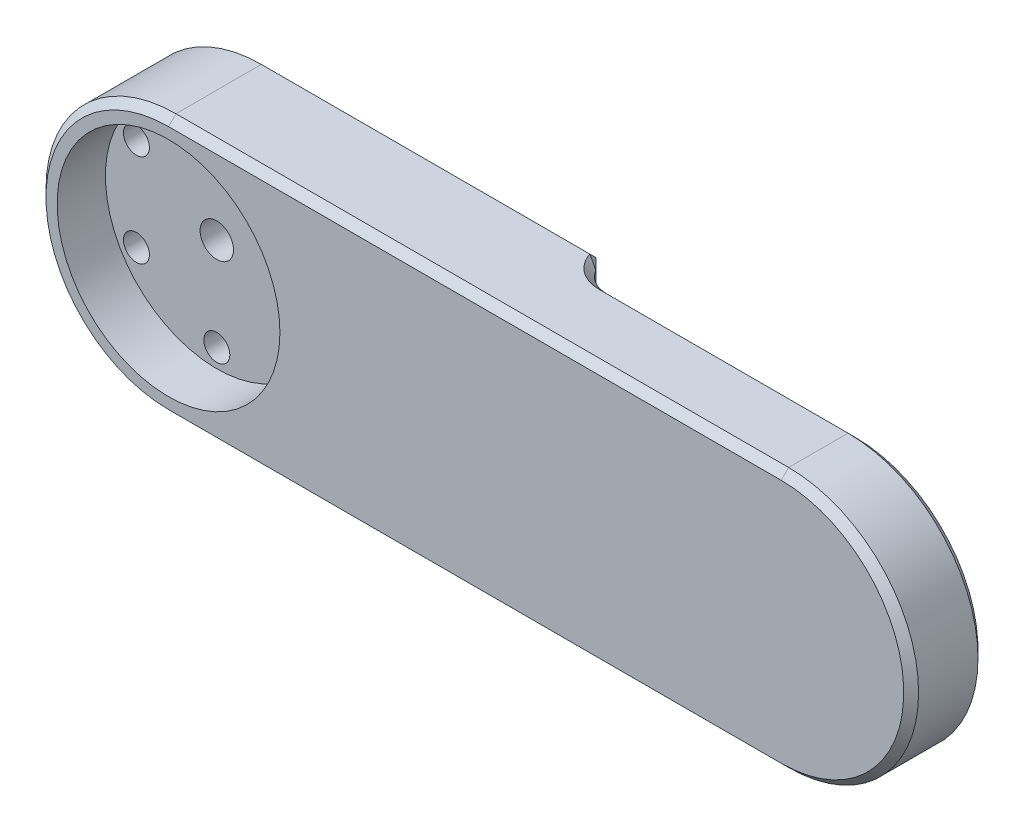
ISO-10303-21;
HEADER;
FILE_DESCRIPTION(('STEP AP214'),'2;1');
FILE_NAME('part.step','',(''),(''),'','','');
FILE_SCHEMA(('AUTOMOTIVE_DESIGN { 1 0 10303 214 1 1 1 1 }'));
ENDSEC;
DATA;
#1=APPLICATION_CONTEXT('core data for automotive mechanical design processes');
#2=APPLICATION_PROTOCOL_DEFINITION('international standard','automotive_design',2000,#1);
#3=PRODUCT_CONTEXT('',#1,'mechanical');
#4=PRODUCT('Part','Part','',(#3));
#5=PRODUCT_RELATED_PRODUCT_CATEGORY('part','',(#4));
#6=PRODUCT_DEFINITION_FORMATION('','',#4);
#7=PRODUCT_DEFINITION_CONTEXT('part definition',#1,'design');
#8=PRODUCT_DEFINITION('design','',#6,#7);
#9=PRODUCT_DEFINITION_SHAPE('','',#8);
#10=(LENGTH_UNIT() NAMED_UNIT(*) SI_UNIT(.MILLI.,.METRE.));
#11=(NAMED_UNIT(*) PLANE_ANGLE_UNIT() SI_UNIT($,.RADIAN.));
#12=(NAMED_UNIT(*) SI_UNIT($,.STERADIAN.) SOLID_ANGLE_UNIT());
#13=UNCERTAINTY_MEASURE_WITH_UNIT(LENGTH_MEASURE(1.E-05),#10,'distance_accuracy_value','');
#14=(GEOMETRIC_REPRESENTATION_CONTEXT(3) GLOBAL_UNCERTAINTY_ASSIGNED_CONTEXT((#13)) GLOBAL_UNIT_ASSIGNED_CONTEXT((#10,
#11,#12)) REPRESENTATION_CONTEXT('',''));
#15=CARTESIAN_POINT('',(0.,0.,0.));
#16=DIRECTION('',(0.,0.,1.));
#17=DIRECTION('',(1.,0.,0.));
#18=AXIS2_PLACEMENT_3D('',#15,#16,#17);
#19=CARTESIAN_POINT('',(-82.5,0.,-13.5));
#20=DIRECTION('',(0.,0.,1.));
#21=DIRECTION('',(1.,0.,0.));
#22=AXIS2_PLACEMENT_3D('',#19,#20,#21);
#23=PLANE('',#22);
#24=DIRECTION('',(1.,0.,0.));
#25=VECTOR('',#24,1.);
#26=CARTESIAN_POINT('',(-82.5,33.,-13.5));
#27=LINE('',#26,#25);
#28=CARTESIAN_POINT('',(-82.5,33.,-13.5));
#29=VERTEX_POINT('',#28);
#30=CARTESIAN_POINT('',(5.56274606680728,33.,-13.5));
#31=VERTEX_POINT('',#30);
#32=EDGE_CURVE('E163',#29,#31,#27,.T.);
#33=ORIENTED_EDGE('',*,*,#32,.T.);
#34=DIRECTION('',(0.,-1.,0.));
#35=VECTOR('',#34,1.);
#36=CARTESIAN_POINT('',(5.56274606680619,-35.,-13.5));
#37=LINE('',#36,#35);
#38=CARTESIAN_POINT('',(5.56274606680622,-33.,-13.5));
#39=VERTEX_POINT('',#38);
#40=EDGE_CURVE('E174',#31,#39,#37,.T.);
#41=ORIENTED_EDGE('',*,*,#40,.T.);
#42=DIRECTION('',(-1.,0.,0.));
#43=VECTOR('',#42,1.);
#44=CARTESIAN_POINT('',(-82.5,-33.,-13.5));
#45=LINE('',#44,#43);
#46=CARTESIAN_POINT('',(-82.5,-33.,-13.5));
#47=VERTEX_POINT('',#46);
#48=EDGE_CURVE('E172',#39,#47,#45,.T.);
#49=ORIENTED_EDGE('',*,*,#48,.T.);
#50=CARTESIAN_POINT('',(-82.5,0.,-13.5));
#51=DIRECTION('',(0.,0.,1.));
#52=DIRECTION('',(1.,0.,0.));
#53=AXIS2_PLACEMENT_3D('',#50,#51,#52);
#54=CIRCLE('',#53,33.);
#55=EDGE_CURVE('E166',#47,#29,#54,.F.);
#56=ORIENTED_EDGE('',*,*,#55,.T.);
#57=EDGE_LOOP('',(#33,#41,#49,#56));
#58=FACE_BOUND('',#57,.T.);
#59=CARTESIAN_POINT('',(-104.15063509461,12.4999999999997,-13.5));
#60=DIRECTION('',(0.,0.,1.));
#61=DIRECTION('',(1.,0.,0.));
#62=AXIS2_PLACEMENT_3D('',#59,#60,#61);
#63=CIRCLE('',#62,3.5);
#64=CARTESIAN_POINT('',(-100.65063509461,12.4999999999997,-13.5));
#65=VERTEX_POINT('',#64);
#66=EDGE_CURVE('E400',#65,#65,#63,.T.);
#67=ORIENTED_EDGE('',*,*,#66,.T.);
#68=EDGE_LOOP('',(#67));
#69=FACE_BOUND('',#68,.T.);
#70=CARTESIAN_POINT('',(-104.15063509461,-12.5000000000004,-13.5));
#71=DIRECTION('',(0.,0.,1.));
#72=DIRECTION('',(1.,0.,0.));
#73=AXIS2_PLACEMENT_3D('',#70,#71,#72);
#74=CIRCLE('',#73,3.50000000000001);
#75=CARTESIAN_POINT('',(-100.65063509461,-12.5000000000004,-13.5));
#76=VERTEX_POINT('',#75);
#77=EDGE_CURVE('E403',#76,#76,#74,.T.);
#78=ORIENTED_EDGE('',*,*,#77,.T.);
#79=EDGE_LOOP('',(#78));
#80=FACE_BOUND('',#79,.T.);
#81=CARTESIAN_POINT('',(-82.5,-25.,-13.5));
#82=DIRECTION('',(0.,0.,1.));
#83=DIRECTION('',(1.,0.,0.));
#84=AXIS2_PLACEMENT_3D('',#81,#82,#83);
#85=CIRCLE('',#84,3.49999999999882);
#86=CARTESIAN_POINT('',(-79.0000000000012,-25.,-13.5));
#87=VERTEX_POINT('',#86);
#88=EDGE_CURVE('E407',#87,#87,#85,.T.);
#89=ORIENTED_EDGE('',*,*,#88,.T.);
#90=EDGE_LOOP('',(#89));
#91=FACE_BOUND('',#90,.T.);
#92=CARTESIAN_POINT('',(-60.849364905388,-12.4999999999995,-13.5));
#93=DIRECTION('',(0.,0.,1.));
#94=DIRECTION('',(1.,0.,0.));
#95=AXIS2_PLACEMENT_3D('',#92,#93,#94);
#96=CIRCLE('',#95,3.50000000000002);
#97=CARTESIAN_POINT('',(-57.349364905388,-12.4999999999995,-13.5));
#98=VERTEX_POINT('',#97);
#99=EDGE_CURVE('E410',#98,#98,#96,.T.);
#100=ORIENTED_EDGE('',*,*,#99,.T.);
#101=EDGE_LOOP('',(#100));
#102=FACE_BOUND('',#101,.T.);
#103=CARTESIAN_POINT('',(-60.8493649053887,12.5000000000006,-13.5));
#104=DIRECTION('',(0.,0.,1.));
#105=DIRECTION('',(1.,0.,0.));
#106=AXIS2_PLACEMENT_3D('',#103,#104,#105);
#107=CIRCLE('',#106,3.50000000000002);
#108=CARTESIAN_POINT('',(-57.3493649053886,12.5000000000006,-13.5));
#109=VERTEX_POINT('',#108);
#110=EDGE_CURVE('E413',#109,#109,#107,.T.);
#111=ORIENTED_EDGE('',*,*,#110,.T.);
#112=EDGE_LOOP('',(#111));
#113=FACE_BOUND('',#112,.T.);
#114=CARTESIAN_POINT('',(-82.5,25.,-13.5));
#115=DIRECTION('',(0.,0.,1.));
#116=DIRECTION('',(1.,0.,0.));
#117=AXIS2_PLACEMENT_3D('',#114,#115,#116);
#118=CIRCLE('',#117,3.50000000000001);
#119=CARTESIAN_POINT('',(-79.,25.,-13.5));
#120=VERTEX_POINT('',#119);
#121=EDGE_CURVE('E399',#120,#120,#118,.T.);
#122=ORIENTED_EDGE('',*,*,#121,.T.);
#123=EDGE_LOOP('',(#122));
#124=FACE_BOUND('',#123,.T.);
#125=CARTESIAN_POINT('',(-82.5,0.,-13.5));
#126=DIRECTION('',(0.,0.,1.));
#127=DIRECTION('',(1.,0.,0.));
#128=AXIS2_PLACEMENT_3D('',#125,#126,#127);
#129=CIRCLE('',#128,4.5);
#130=CARTESIAN_POINT('',(-78.,0.,-13.5));
#131=VERTEX_POINT('',#130);
#132=EDGE_CURVE('E147',#131,#131,#129,.T.);
#133=ORIENTED_EDGE('',*,*,#132,.T.);
#134=EDGE_LOOP('',(#133));
#135=FACE_BOUND('',#134,.T.);
#136=ADVANCED_FACE('F39',(#58,#69,#80,#91,#102,#113,#124,#135),#23,.F.);
#137=CARTESIAN_POINT('',(82.5,0.,13.5));
#138=DIRECTION('',(0.,0.,-1.));
#139=DIRECTION('',(-1.,0.,0.));
#140=AXIS2_PLACEMENT_3D('',#137,#138,#139);
#141=CYLINDRICAL_SURFACE('',#140,35.);
#142=DIRECTION('',(0.,0.,-1.));
#143=VECTOR('',#142,1.);
#144=CARTESIAN_POINT('',(82.5,35.,13.5));
#145=LINE('',#144,#143);
#146=CARTESIAN_POINT('',(82.5,35.,11.5));
#147=VERTEX_POINT('',#146);
#148=CARTESIAN_POINT('',(82.5,35.,-4.5));
#149=VERTEX_POINT('',#148);
#150=EDGE_CURVE('E392',#147,#149,#145,.T.);
#151=ORIENTED_EDGE('',*,*,#150,.F.);
#152=CARTESIAN_POINT('',(82.5,0.,11.5));
#153=DIRECTION('',(0.,0.,1.));
#154=DIRECTION('',(1.,0.,0.));
#155=AXIS2_PLACEMENT_3D('',#152,#153,#154);
#156=CIRCLE('',#155,35.);
#157=CARTESIAN_POINT('',(82.5,-35.,11.5));
#158=VERTEX_POINT('',#157);
#159=EDGE_CURVE('E196',#147,#158,#156,.F.);
#160=ORIENTED_EDGE('',*,*,#159,.T.);
#161=DIRECTION('',(0.,0.,-1.));
#162=VECTOR('',#161,1.);
#163=CARTESIAN_POINT('',(82.5,-35.,13.5));
#164=LINE('',#163,#162);
#165=CARTESIAN_POINT('',(82.5,-35.,-4.5));
#166=VERTEX_POINT('',#165);
#167=EDGE_CURVE('E382',#158,#166,#164,.T.);
#168=ORIENTED_EDGE('',*,*,#167,.T.);
#169=CARTESIAN_POINT('',(82.5,0.,-4.5));
#170=DIRECTION('',(0.,0.,-1.));
#171=DIRECTION('',(-1.,0.,0.));
#172=AXIS2_PLACEMENT_3D('',#169,#170,#171);
#173=CIRCLE('',#172,35.);
#174=EDGE_CURVE('E194',#166,#149,#173,.F.);
#175=ORIENTED_EDGE('',*,*,#174,.T.);
#176=EDGE_LOOP('',(#151,#160,#168,#175));
#177=FACE_BOUND('',#176,.T.);
#178=ADVANCED_FACE('F326',(#177),#141,.T.);
#179=CARTESIAN_POINT('',(-82.5,0.,13.5));
#180=DIRECTION('',(0.,0.,-1.));
#181=DIRECTION('',(-1.,0.,0.));
#182=AXIS2_PLACEMENT_3D('',#179,#180,#181);
#183=CYLINDRICAL_SURFACE('',#182,35.);
#184=DIRECTION('',(0.,0.,-1.));
#185=VECTOR('',#184,1.);
#186=CARTESIAN_POINT('',(-82.5,-35.,13.5));
#187=LINE('',#186,#185);
#188=CARTESIAN_POINT('',(-82.5,-35.,11.5));
#189=VERTEX_POINT('',#188);
#190=CARTESIAN_POINT('',(-82.5,-35.,-11.5));
#191=VERTEX_POINT('',#190);
#192=EDGE_CURVE('E380',#189,#191,#187,.T.);
#193=ORIENTED_EDGE('',*,*,#192,.F.);
#194=CARTESIAN_POINT('',(-82.5,0.,11.5));
#195=DIRECTION('',(0.,0.,1.));
#196=DIRECTION('',(1.,0.,0.));
#197=AXIS2_PLACEMENT_3D('',#194,#195,#196);
#198=CIRCLE('',#197,35.);
#199=CARTESIAN_POINT('',(-82.5,35.,11.5));
#200=VERTEX_POINT('',#199);
#201=EDGE_CURVE('E200',#189,#200,#198,.F.);
#202=ORIENTED_EDGE('',*,*,#201,.T.);
#203=DIRECTION('',(0.,0.,-1.));
#204=VECTOR('',#203,1.);
#205=CARTESIAN_POINT('',(-82.5,35.,13.5));
#206=LINE('',#205,#204);
#207=CARTESIAN_POINT('',(-82.5,35.,-11.5));
#208=VERTEX_POINT('',#207);
#209=EDGE_CURVE('E146',#200,#208,#206,.T.);
#210=ORIENTED_EDGE('',*,*,#209,.T.);
#211=CARTESIAN_POINT('',(-82.5,0.,-11.5));
#212=DIRECTION('',(0.,0.,1.));
#213=DIRECTION('',(1.,0.,0.));
#214=AXIS2_PLACEMENT_3D('',#211,#212,#213);
#215=CIRCLE('',#214,35.);
#216=EDGE_CURVE('E198',#208,#191,#215,.T.);
#217=ORIENTED_EDGE('',*,*,#216,.T.);
#218=EDGE_LOOP('',(#193,#202,#210,#217));
#219=FACE_BOUND('',#218,.T.);
#220=ADVANCED_FACE('F332',(#219),#183,.T.);
#221=CARTESIAN_POINT('',(-82.5,-35.,13.5));
#222=DIRECTION('',(0.,1.,0.));
#223=DIRECTION('',(-1.,0.,0.));
#224=AXIS2_PLACEMENT_3D('',#221,#222,#223);
#225=PLANE('',#224);
#226=ORIENTED_EDGE('',*,*,#167,.F.);
#227=DIRECTION('',(-1.,0.,0.));
#228=VECTOR('',#227,1.);
#229=CARTESIAN_POINT('',(-82.5,-35.,11.5));
#230=LINE('',#229,#228);
#231=EDGE_CURVE('E191',#158,#189,#230,.T.);
#232=ORIENTED_EDGE('',*,*,#231,.T.);
#233=ORIENTED_EDGE('',*,*,#192,.T.);
#234=DIRECTION('',(1.,0.,0.));
#235=VECTOR('',#234,1.);
#236=CARTESIAN_POINT('',(-82.5,-35.,-11.5));
#237=LINE('',#236,#235);
#238=CARTESIAN_POINT('',(5.96060798583056,-35.,-11.5));
#239=VERTEX_POINT('',#238);
#240=EDGE_CURVE('E186',#191,#239,#237,.T.);
#241=ORIENTED_EDGE('',*,*,#240,.T.);
#242=CARTESIAN_POINT('',(15.5,-35.,-14.5));
#243=DIRECTION('',(0.,1.,0.));
#244=DIRECTION('',(-1.,0.,0.));
#245=AXIS2_PLACEMENT_3D('',#242,#243,#244);
#246=CIRCLE('',#245,10.);
#247=CARTESIAN_POINT('',(15.5,-35.,-4.5));
#248=VERTEX_POINT('',#247);
#249=EDGE_CURVE('E188',#239,#248,#246,.T.);
#250=ORIENTED_EDGE('',*,*,#249,.T.);
#251=DIRECTION('',(1.,0.,0.));
#252=VECTOR('',#251,1.);
#253=CARTESIAN_POINT('',(82.5,-35.,-4.5));
#254=LINE('',#253,#252);
#255=EDGE_CURVE('E152',#248,#166,#254,.T.);
#256=ORIENTED_EDGE('',*,*,#255,.T.);
#257=EDGE_LOOP('',(#226,#232,#233,#241,#250,#256));
#258=FACE_BOUND('',#257,.T.);
#259=ADVANCED_FACE('F342',(#258),#225,.F.);
#260=CARTESIAN_POINT('',(-82.5,35.,13.5));
#261=DIRECTION('',(0.,-1.,0.));
#262=DIRECTION('',(1.,0.,0.));
#263=AXIS2_PLACEMENT_3D('',#260,#261,#262);
#264=PLANE('',#263);
#265=ORIENTED_EDGE('',*,*,#209,.F.);
#266=DIRECTION('',(1.,0.,0.));
#267=VECTOR('',#266,1.);
#268=CARTESIAN_POINT('',(82.5,35.,11.5));
#269=LINE('',#268,#267);
#270=EDGE_CURVE('E208',#200,#147,#269,.T.);
#271=ORIENTED_EDGE('',*,*,#270,.T.);
#272=ORIENTED_EDGE('',*,*,#150,.T.);
#273=DIRECTION('',(-1.,0.,0.));
#274=VECTOR('',#273,1.);
#275=CARTESIAN_POINT('',(15.5,35.,-4.50000000000001));
#276=LINE('',#275,#274);
#277=CARTESIAN_POINT('',(15.5,35.,-4.49999999999996));
#278=VERTEX_POINT('',#277);
#279=EDGE_CURVE('E206',#149,#278,#276,.T.);
#280=ORIENTED_EDGE('',*,*,#279,.T.);
#281=CARTESIAN_POINT('',(15.5,35.,-14.5));
#282=DIRECTION('',(0.,-1.,0.));
#283=DIRECTION('',(1.,0.,0.));
#284=AXIS2_PLACEMENT_3D('',#281,#282,#283);
#285=CIRCLE('',#284,10.0000000000001);
#286=CARTESIAN_POINT('',(5.96060798583051,35.,-11.5));
#287=VERTEX_POINT('',#286);
#288=EDGE_CURVE('E204',#278,#287,#285,.T.);
#289=ORIENTED_EDGE('',*,*,#288,.T.);
#290=DIRECTION('',(-1.,0.,0.));
#291=VECTOR('',#290,1.);
#292=CARTESIAN_POINT('',(-82.5,35.,-11.5));
#293=LINE('',#292,#291);
#294=EDGE_CURVE('E202',#287,#208,#293,.T.);
#295=ORIENTED_EDGE('',*,*,#294,.T.);
#296=EDGE_LOOP('',(#265,#271,#272,#280,#289,#295));
#297=FACE_BOUND('',#296,.T.);
#298=ADVANCED_FACE('F340',(#297),#264,.F.);
#299=CARTESIAN_POINT('',(-82.5,0.,13.5));
#300=DIRECTION('',(0.,0.,1.));
#301=DIRECTION('',(1.,0.,0.));
#302=AXIS2_PLACEMENT_3D('',#299,#300,#301);
#303=PLANE('',#302);
#304=CARTESIAN_POINT('',(-82.5,0.,13.5));
#305=DIRECTION('',(0.,0.,1.));
#306=DIRECTION('',(1.,0.,0.));
#307=AXIS2_PLACEMENT_3D('',#304,#305,#306);
#308=CIRCLE('',#307,33.);
#309=CARTESIAN_POINT('',(-82.5,33.,13.5));
#310=VERTEX_POINT('',#309);
#311=CARTESIAN_POINT('',(-82.5,-33.,13.5));
#312=VERTEX_POINT('',#311);
#313=EDGE_CURVE('E179',#310,#312,#308,.T.);
#314=ORIENTED_EDGE('',*,*,#313,.T.);
#315=DIRECTION('',(1.,0.,0.));
#316=VECTOR('',#315,1.);
#317=CARTESIAN_POINT('',(82.5,-33.,13.5));
#318=LINE('',#317,#316);
#319=CARTESIAN_POINT('',(82.5,-33.,13.5));
#320=VERTEX_POINT('',#319);
#321=EDGE_CURVE('E183',#312,#320,#318,.T.);
#322=ORIENTED_EDGE('',*,*,#321,.T.);
#323=CARTESIAN_POINT('',(82.5,0.,13.5));
#324=DIRECTION('',(0.,0.,1.));
#325=DIRECTION('',(1.,0.,0.));
#326=AXIS2_PLACEMENT_3D('',#323,#324,#325);
#327=CIRCLE('',#326,33.);
#328=CARTESIAN_POINT('',(82.5,33.,13.5));
#329=VERTEX_POINT('',#328);
#330=EDGE_CURVE('E181',#320,#329,#327,.T.);
#331=ORIENTED_EDGE('',*,*,#330,.T.);
#332=DIRECTION('',(-1.,0.,0.));
#333=VECTOR('',#332,1.);
#334=CARTESIAN_POINT('',(-82.5,33.,13.5));
#335=LINE('',#334,#333);
#336=EDGE_CURVE('E177',#329,#310,#335,.T.);
#337=ORIENTED_EDGE('',*,*,#336,.T.);
#338=EDGE_LOOP('',(#314,#322,#331,#337));
#339=FACE_BOUND('',#338,.T.);
#340=CARTESIAN_POINT('',(-82.5,0.,13.5));
#341=DIRECTION('',(0.,0.,-1.));
#342=DIRECTION('',(-1.,0.,0.));
#343=AXIS2_PLACEMENT_3D('',#340,#341,#342);
#344=CIRCLE('',#343,30.);
#345=CARTESIAN_POINT('',(-52.5,0.,13.5));
#346=VERTEX_POINT('',#345);
#347=EDGE_CURVE('E434',#346,#346,#344,.T.);
#348=ORIENTED_EDGE('',*,*,#347,.T.);
#349=EDGE_LOOP('',(#348));
#350=FACE_BOUND('',#349,.T.);
#351=ADVANCED_FACE('F338',(#339,#350),#303,.T.);
#352=CARTESIAN_POINT('',(117.5,-343.357544094514,-6.5));
#353=DIRECTION('',(0.,0.,-1.));
#354=DIRECTION('',(-1.,0.,0.));
#355=AXIS2_PLACEMENT_3D('',#352,#353,#354);
#356=PLANE('',#355);
#357=CARTESIAN_POINT('',(82.5,0.,-6.50000000000001));
#358=DIRECTION('',(0.,0.,-1.));
#359=DIRECTION('',(-1.,0.,0.));
#360=AXIS2_PLACEMENT_3D('',#357,#358,#359);
#361=CIRCLE('',#360,15.);
#362=CARTESIAN_POINT('',(67.5,0.,-6.50000000000001));
#363=VERTEX_POINT('',#362);
#364=EDGE_CURVE('E444',#363,#363,#361,.T.);
#365=ORIENTED_EDGE('',*,*,#364,.F.);
#366=EDGE_LOOP('',(#365));
#367=FACE_BOUND('',#366,.T.);
#368=CARTESIAN_POINT('',(82.5,0.,-6.50000000000001));
#369=DIRECTION('',(0.,0.,-1.));
#370=DIRECTION('',(-1.,0.,0.));
#371=AXIS2_PLACEMENT_3D('',#368,#369,#370);
#372=CIRCLE('',#371,33.);
#373=CARTESIAN_POINT('',(82.5,33.,-6.50000000000001));
#374=VERTEX_POINT('',#373);
#375=CARTESIAN_POINT('',(82.5,-33.,-6.50000000000001));
#376=VERTEX_POINT('',#375);
#377=EDGE_CURVE('E49',#374,#376,#372,.T.);
#378=ORIENTED_EDGE('',*,*,#377,.T.);
#379=DIRECTION('',(-1.,0.,0.));
#380=VECTOR('',#379,1.);
#381=CARTESIAN_POINT('',(15.5,-32.9999999999999,-6.50000000000001));
#382=LINE('',#381,#380);
#383=CARTESIAN_POINT('',(15.5,-33.,-6.50000000000001));
#384=VERTEX_POINT('',#383);
#385=EDGE_CURVE('E12',#376,#384,#382,.T.);
#386=ORIENTED_EDGE('',*,*,#385,.T.);
#387=DIRECTION('',(0.,1.,0.));
#388=VECTOR('',#387,1.);
#389=CARTESIAN_POINT('',(15.5000000000001,-343.357544094514,-6.50000000000001));
#390=LINE('',#389,#388);
#391=CARTESIAN_POINT('',(15.5,32.9999999999999,-6.50000000000001));
#392=VERTEX_POINT('',#391);
#393=EDGE_CURVE('E134',#384,#392,#390,.T.);
#394=ORIENTED_EDGE('',*,*,#393,.T.);
#395=DIRECTION('',(1.,0.,0.));
#396=VECTOR('',#395,1.);
#397=CARTESIAN_POINT('',(82.5,33.,-6.50000000000001));
#398=LINE('',#397,#396);
#399=EDGE_CURVE('E60',#392,#374,#398,.T.);
#400=ORIENTED_EDGE('',*,*,#399,.T.);
#401=EDGE_LOOP('',(#378,#386,#394,#400));
#402=FACE_BOUND('',#401,.T.);
#403=ADVANCED_FACE('F133',(#367,#402),#356,.T.);
#404=CARTESIAN_POINT('',(15.5000000000001,-343.357544094514,-14.5));
#405=DIRECTION('',(0.,1.,0.));
#406=DIRECTION('',(-1.,0.,0.));
#407=AXIS2_PLACEMENT_3D('',#404,#405,#406);
#408=CYLINDRICAL_SURFACE('',#407,8.);
#409=ORIENTED_EDGE('',*,*,#393,.F.);
#410=CARTESIAN_POINT('',(15.5,-33.,-14.5));
#411=DIRECTION('',(0.,1.,0.));
#412=DIRECTION('',(0.,0.,1.));
#413=AXIS2_PLACEMENT_3D('',#410,#411,#412);
#414=CIRCLE('',#413,8.);
#415=CARTESIAN_POINT('',(8.58426588456793,-33.,-10.4784801822385));
#416=VERTEX_POINT('',#415);
#417=EDGE_CURVE('E142',#384,#416,#414,.F.);
#418=ORIENTED_EDGE('',*,*,#417,.T.);
#419=DIRECTION('',(0.,1.,0.));
#420=VECTOR('',#419,1.);
#421=CARTESIAN_POINT('',(8.58426588456671,-343.357544094514,-10.4784801822407));
#422=LINE('',#421,#420);
#423=CARTESIAN_POINT('',(8.58426588456819,33.,-10.478480182238));
#424=VERTEX_POINT('',#423);
#425=EDGE_CURVE('E164',#416,#424,#422,.T.);
#426=ORIENTED_EDGE('',*,*,#425,.T.);
#427=CARTESIAN_POINT('',(15.5,33.,-14.5));
#428=DIRECTION('',(0.,-1.,0.));
#429=DIRECTION('',(1.,0.,0.));
#430=AXIS2_PLACEMENT_3D('',#427,#428,#429);
#431=CIRCLE('',#430,8.);
#432=EDGE_CURVE('E145',#424,#392,#431,.F.);
#433=ORIENTED_EDGE('',*,*,#432,.T.);
#434=EDGE_LOOP('',(#409,#418,#426,#433));
#435=FACE_BOUND('',#434,.T.);
#436=ADVANCED_FACE('F139',(#435),#408,.F.);
#437=CARTESIAN_POINT('',(-82.5,0.,-13.5));
#438=DIRECTION('',(0.,0.,1.));
#439=DIRECTION('',(1.,0.,0.));
#440=AXIS2_PLACEMENT_3D('',#437,#438,#439);
#441=CYLINDRICAL_SURFACE('',#440,4.5);
#442=CARTESIAN_POINT('',(-82.5,0.,0.5));
#443=DIRECTION('',(0.,0.,-1.));
#444=DIRECTION('',(-1.,0.,0.));
#445=AXIS2_PLACEMENT_3D('',#442,#443,#444);
#446=CIRCLE('',#445,4.5);
#447=CARTESIAN_POINT('',(-87.,0.,0.5));
#448=VERTEX_POINT('',#447);
#449=EDGE_CURVE('E404',#448,#448,#446,.F.);
#450=ORIENTED_EDGE('',*,*,#449,.T.);
#451=EDGE_LOOP('',(#450));
#452=FACE_BOUND('',#451,.T.);
#453=ORIENTED_EDGE('',*,*,#132,.F.);
#454=EDGE_LOOP('',(#453));
#455=FACE_BOUND('',#454,.T.);
#456=ADVANCED_FACE('F456',(#452,#455),#441,.F.);
#457=CARTESIAN_POINT('',(-82.5,25.,-13.5));
#458=DIRECTION('',(0.,0.,1.));
#459=DIRECTION('',(1.,0.,0.));
#460=AXIS2_PLACEMENT_3D('',#457,#458,#459);
#461=CYLINDRICAL_SURFACE('',#460,3.50000000000001);
#462=CARTESIAN_POINT('',(-82.5,25.,0.5));
#463=DIRECTION('',(0.,0.,-1.));
#464=DIRECTION('',(-1.,0.,0.));
#465=AXIS2_PLACEMENT_3D('',#462,#463,#464);
#466=CIRCLE('',#465,3.50000000000001);
#467=CARTESIAN_POINT('',(-86.,25.,0.5));
#468=VERTEX_POINT('',#467);
#469=EDGE_CURVE('E420',#468,#468,#466,.F.);
#470=ORIENTED_EDGE('',*,*,#469,.T.);
#471=EDGE_LOOP('',(#470));
#472=FACE_BOUND('',#471,.T.);
#473=ORIENTED_EDGE('',*,*,#121,.F.);
#474=EDGE_LOOP('',(#473));
#475=FACE_BOUND('',#474,.T.);
#476=ADVANCED_FACE('F462',(#472,#475),#461,.F.);
#477=CARTESIAN_POINT('',(-60.8493649053887,12.5000000000006,-13.5));
#478=DIRECTION('',(0.,0.,1.));
#479=DIRECTION('',(1.,0.,0.));
#480=AXIS2_PLACEMENT_3D('',#477,#478,#479);
#481=CYLINDRICAL_SURFACE('',#480,3.50000000000002);
#482=CARTESIAN_POINT('',(-60.8493649053887,12.5000000000006,0.5));
#483=DIRECTION('',(0.,0.,-1.));
#484=DIRECTION('',(-1.,0.,0.));
#485=AXIS2_PLACEMENT_3D('',#482,#483,#484);
#486=CIRCLE('',#485,3.50000000000002);
#487=CARTESIAN_POINT('',(-64.3493649053887,12.5000000000006,0.5));
#488=VERTEX_POINT('',#487);
#489=EDGE_CURVE('E423',#488,#488,#486,.F.);
#490=ORIENTED_EDGE('',*,*,#489,.T.);
#491=EDGE_LOOP('',(#490));
#492=FACE_BOUND('',#491,.T.);
#493=ORIENTED_EDGE('',*,*,#110,.F.);
#494=EDGE_LOOP('',(#493));
#495=FACE_BOUND('',#494,.T.);
#496=ADVANCED_FACE('F480',(#492,#495),#481,.F.);
#497=CARTESIAN_POINT('',(-60.849364905388,-12.4999999999995,-13.5));
#498=DIRECTION('',(0.,0.,1.));
#499=DIRECTION('',(1.,0.,0.));
#500=AXIS2_PLACEMENT_3D('',#497,#498,#499);
#501=CYLINDRICAL_SURFACE('',#500,3.50000000000002);
#502=CARTESIAN_POINT('',(-60.849364905388,-12.4999999999995,0.5));
#503=DIRECTION('',(0.,0.,-1.));
#504=DIRECTION('',(-1.,0.,0.));
#505=AXIS2_PLACEMENT_3D('',#502,#503,#504);
#506=CIRCLE('',#505,3.50000000000002);
#507=CARTESIAN_POINT('',(-64.349364905388,-12.4999999999995,0.5));
#508=VERTEX_POINT('',#507);
#509=EDGE_CURVE('E426',#508,#508,#506,.F.);
#510=ORIENTED_EDGE('',*,*,#509,.T.);
#511=EDGE_LOOP('',(#510));
#512=FACE_BOUND('',#511,.T.);
#513=ORIENTED_EDGE('',*,*,#99,.F.);
#514=EDGE_LOOP('',(#513));
#515=FACE_BOUND('',#514,.T.);
#516=ADVANCED_FACE('F476',(#512,#515),#501,.F.);
#517=CARTESIAN_POINT('',(-82.5,-25.,-13.5));
#518=DIRECTION('',(0.,0.,1.));
#519=DIRECTION('',(1.,0.,0.));
#520=AXIS2_PLACEMENT_3D('',#517,#518,#519);
#521=CYLINDRICAL_SURFACE('',#520,3.49999999999882);
#522=CARTESIAN_POINT('',(-82.5,-25.,0.5));
#523=DIRECTION('',(0.,0.,-1.));
#524=DIRECTION('',(-1.,0.,0.));
#525=AXIS2_PLACEMENT_3D('',#522,#523,#524);
#526=CIRCLE('',#525,3.49999999999882);
#527=CARTESIAN_POINT('',(-85.9999999999988,-25.,0.5));
#528=VERTEX_POINT('',#527);
#529=EDGE_CURVE('E429',#528,#528,#526,.F.);
#530=ORIENTED_EDGE('',*,*,#529,.T.);
#531=EDGE_LOOP('',(#530));
#532=FACE_BOUND('',#531,.T.);
#533=ORIENTED_EDGE('',*,*,#88,.F.);
#534=EDGE_LOOP('',(#533));
#535=FACE_BOUND('',#534,.T.);
#536=ADVANCED_FACE('F472',(#532,#535),#521,.F.);
#537=CARTESIAN_POINT('',(-104.15063509461,-12.5000000000004,-13.5));
#538=DIRECTION('',(0.,0.,1.));
#539=DIRECTION('',(1.,0.,0.));
#540=AXIS2_PLACEMENT_3D('',#537,#538,#539);
#541=CYLINDRICAL_SURFACE('',#540,3.50000000000001);
#542=CARTESIAN_POINT('',(-104.15063509461,-12.5000000000004,0.5));
#543=DIRECTION('',(0.,0.,-1.));
#544=DIRECTION('',(-1.,0.,0.));
#545=AXIS2_PLACEMENT_3D('',#542,#543,#544);
#546=CIRCLE('',#545,3.50000000000001);
#547=CARTESIAN_POINT('',(-107.65063509461,-12.5000000000004,0.5));
#548=VERTEX_POINT('',#547);
#549=EDGE_CURVE('E387',#548,#548,#546,.F.);
#550=ORIENTED_EDGE('',*,*,#549,.T.);
#551=EDGE_LOOP('',(#550));
#552=FACE_BOUND('',#551,.T.);
#553=ORIENTED_EDGE('',*,*,#77,.F.);
#554=EDGE_LOOP('',(#553));
#555=FACE_BOUND('',#554,.T.);
#556=ADVANCED_FACE('F468',(#552,#555),#541,.F.);
#557=CARTESIAN_POINT('',(-104.15063509461,12.4999999999997,-13.5));
#558=DIRECTION('',(0.,0.,1.));
#559=DIRECTION('',(1.,0.,0.));
#560=AXIS2_PLACEMENT_3D('',#557,#558,#559);
#561=CYLINDRICAL_SURFACE('',#560,3.5);
#562=CARTESIAN_POINT('',(-104.15063509461,12.4999999999997,0.5));
#563=DIRECTION('',(0.,0.,-1.));
#564=DIRECTION('',(-1.,0.,0.));
#565=AXIS2_PLACEMENT_3D('',#562,#563,#564);
#566=CIRCLE('',#565,3.5);
#567=CARTESIAN_POINT('',(-107.65063509461,12.4999999999997,0.5));
#568=VERTEX_POINT('',#567);
#569=EDGE_CURVE('E385',#568,#568,#566,.F.);
#570=ORIENTED_EDGE('',*,*,#569,.T.);
#571=EDGE_LOOP('',(#570));
#572=FACE_BOUND('',#571,.T.);
#573=ORIENTED_EDGE('',*,*,#66,.F.);
#574=EDGE_LOOP('',(#573));
#575=FACE_BOUND('',#574,.T.);
#576=ADVANCED_FACE('F464',(#572,#575),#561,.F.);
#577=CARTESIAN_POINT('',(-82.5,0.,0.5));
#578=DIRECTION('',(0.,0.,-1.));
#579=DIRECTION('',(-1.,0.,0.));
#580=AXIS2_PLACEMENT_3D('',#577,#578,#579);
#581=PLANE('',#580);
#582=ORIENTED_EDGE('',*,*,#469,.F.);
#583=EDGE_LOOP('',(#582));
#584=FACE_BOUND('',#583,.T.);
#585=ORIENTED_EDGE('',*,*,#509,.F.);
#586=EDGE_LOOP('',(#585));
#587=FACE_BOUND('',#586,.T.);
#588=ORIENTED_EDGE('',*,*,#549,.F.);
#589=EDGE_LOOP('',(#588));
#590=FACE_BOUND('',#589,.T.);
#591=CARTESIAN_POINT('',(-82.5,0.,0.5));
#592=DIRECTION('',(0.,0.,-1.));
#593=DIRECTION('',(-1.,0.,0.));
#594=AXIS2_PLACEMENT_3D('',#591,#592,#593);
#595=CIRCLE('',#594,30.);
#596=CARTESIAN_POINT('',(-52.5,0.,0.500000000000001));
#597=VERTEX_POINT('',#596);
#598=EDGE_CURVE('E388',#597,#597,#595,.T.);
#599=ORIENTED_EDGE('',*,*,#598,.F.);
#600=EDGE_LOOP('',(#599));
#601=FACE_BOUND('',#600,.T.);
#602=ORIENTED_EDGE('',*,*,#569,.F.);
#603=EDGE_LOOP('',(#602));
#604=FACE_BOUND('',#603,.T.);
#605=ORIENTED_EDGE('',*,*,#529,.F.);
#606=EDGE_LOOP('',(#605));
#607=FACE_BOUND('',#606,.T.);
#608=ORIENTED_EDGE('',*,*,#489,.F.);
#609=EDGE_LOOP('',(#608));
#610=FACE_BOUND('',#609,.T.);
#611=ORIENTED_EDGE('',*,*,#449,.F.);
#612=EDGE_LOOP('',(#611));
#613=FACE_BOUND('',#612,.T.);
#614=ADVANCED_FACE('F467',(#584,#587,#590,#601,#604,#607,#610,#613),#581,.F.);
#615=CARTESIAN_POINT('',(-82.5,0.,0.5));
#616=DIRECTION('',(0.,0.,1.));
#617=DIRECTION('',(1.,0.,0.));
#618=AXIS2_PLACEMENT_3D('',#615,#616,#617);
#619=CYLINDRICAL_SURFACE('',#618,30.);
#620=CARTESIAN_POINT('',(-52.5,0.,0.500000000000001));
#621=CARTESIAN_POINT('',(-52.5,0.,0.635416666666667));
#622=CARTESIAN_POINT('',(-52.5,0.,0.770833333333334));
#623=CARTESIAN_POINT('',(-52.5,0.,1.04166666666667));
#624=CARTESIAN_POINT('',(-52.5,0.,1.17708333333333));
#625=CARTESIAN_POINT('',(-52.5,0.,1.44791666666667));
#626=CARTESIAN_POINT('',(-52.5,0.,1.58333333333333));
#627=CARTESIAN_POINT('',(-52.5,0.,1.85416666666667));
#628=CARTESIAN_POINT('',(-52.5,0.,1.98958333333333));
#629=CARTESIAN_POINT('',(-52.5,0.,2.26041666666667));
#630=CARTESIAN_POINT('',(-52.5,0.,2.39583333333333));
#631=CARTESIAN_POINT('',(-52.5,0.,2.66666666666667));
#632=CARTESIAN_POINT('',(-52.5,0.,2.80208333333333));
#633=CARTESIAN_POINT('',(-52.5,0.,3.07291666666667));
#634=CARTESIAN_POINT('',(-52.5,0.,3.20833333333333));
#635=CARTESIAN_POINT('',(-52.5,0.,3.47916666666667));
#636=CARTESIAN_POINT('',(-52.5,0.,3.61458333333333));
#637=CARTESIAN_POINT('',(-52.5,0.,3.88541666666667));
#638=CARTESIAN_POINT('',(-52.5,0.,4.02083333333333));
#639=CARTESIAN_POINT('',(-52.5,0.,4.29166666666667));
#640=CARTESIAN_POINT('',(-52.5,0.,4.42708333333333));
#641=CARTESIAN_POINT('',(-52.5,0.,4.69791666666667));
#642=CARTESIAN_POINT('',(-52.5,0.,4.83333333333333));
#643=CARTESIAN_POINT('',(-52.5,0.,5.10416666666667));
#644=CARTESIAN_POINT('',(-52.5,0.,5.23958333333333));
#645=CARTESIAN_POINT('',(-52.5,0.,5.51041666666667));
#646=CARTESIAN_POINT('',(-52.5,0.,5.64583333333333));
#647=CARTESIAN_POINT('',(-52.5,0.,5.91666666666667));
#648=CARTESIAN_POINT('',(-52.5,0.,6.05208333333333));
#649=CARTESIAN_POINT('',(-52.5,0.,6.32291666666667));
#650=CARTESIAN_POINT('',(-52.5,0.,6.45833333333333));
#651=CARTESIAN_POINT('',(-52.5,0.,6.72916666666667));
#652=CARTESIAN_POINT('',(-52.5,0.,6.86458333333333));
#653=CARTESIAN_POINT('',(-52.5,0.,7.13541666666667));
#654=CARTESIAN_POINT('',(-52.5,0.,7.27083333333333));
#655=CARTESIAN_POINT('',(-52.5,0.,7.54166666666667));
#656=CARTESIAN_POINT('',(-52.5,0.,7.67708333333333));
#657=CARTESIAN_POINT('',(-52.5,0.,7.94791666666667));
#658=CARTESIAN_POINT('',(-52.5,0.,8.08333333333333));
#659=CARTESIAN_POINT('',(-52.5,0.,8.35416666666667));
#660=CARTESIAN_POINT('',(-52.5,0.,8.48958333333333));
#661=CARTESIAN_POINT('',(-52.5,0.,8.76041666666667));
#662=CARTESIAN_POINT('',(-52.5,0.,8.89583333333333));
#663=CARTESIAN_POINT('',(-52.5,0.,9.16666666666667));
#664=CARTESIAN_POINT('',(-52.5,0.,9.30208333333333));
#665=CARTESIAN_POINT('',(-52.5,0.,9.57291666666667));
#666=CARTESIAN_POINT('',(-52.5,0.,9.70833333333333));
#667=CARTESIAN_POINT('',(-52.5,0.,9.97916666666667));
#668=CARTESIAN_POINT('',(-52.5,0.,10.1145833333333));
#669=CARTESIAN_POINT('',(-52.5,0.,10.3854166666667));
#670=CARTESIAN_POINT('',(-52.5,0.,10.5208333333333));
#671=CARTESIAN_POINT('',(-52.5,0.,10.7916666666667));
#672=CARTESIAN_POINT('',(-52.5,0.,10.9270833333333));
#673=CARTESIAN_POINT('',(-52.5,0.,11.1979166666667));
#674=CARTESIAN_POINT('',(-52.5,0.,11.3333333333333));
#675=CARTESIAN_POINT('',(-52.5,0.,11.6041666666667));
#676=CARTESIAN_POINT('',(-52.5,0.,11.7395833333333));
#677=CARTESIAN_POINT('',(-52.5,0.,12.0104166666667));
#678=CARTESIAN_POINT('',(-52.5,0.,12.1458333333333));
#679=CARTESIAN_POINT('',(-52.5,0.,12.4166666666667));
#680=CARTESIAN_POINT('',(-52.5,0.,12.5520833333333));
#681=CARTESIAN_POINT('',(-52.5,0.,12.8229166666667));
#682=CARTESIAN_POINT('',(-52.5,0.,12.9583333333333));
#683=CARTESIAN_POINT('',(-52.5,0.,13.2291666666667));
#684=CARTESIAN_POINT('',(-52.5,0.,13.3645833333333));
#685=CARTESIAN_POINT('',(-52.5,0.,13.5));
#686=B_SPLINE_CURVE_WITH_KNOTS('',3,(#620,#621,#622,#623,#624,#625,#626,#627,#628,#629,#630,
#631,#632,#633,#634,#635,#636,#637,#638,#639,#640,#641,#642,#643,#644,#645,#646,#647,#648,#649,
#650,#651,#652,#653,#654,#655,#656,#657,#658,#659,#660,#661,#662,#663,#664,#665,#666,#667,#668,
#669,#670,#671,#672,#673,#674,#675,#676,#677,#678,#679,#680,#681,#682,#683,#684,#685),
.UNSPECIFIED.,.F.,.F.,(4,2,2,2,2,2,2,2,2,2,2,2,2,2,2,2,2,2,2,2,2,2,2,2,2,2,2,2,2,2,2,2,4),(0.,
0.40625,0.8125,1.21875,1.625,2.03125,2.4375,2.84375,3.25,3.65625,4.0625,4.46875,4.875,5.28125,
5.6875,6.09375,6.5,6.90625,7.3125,7.71875,8.125,8.53125,8.9375,9.34375,9.75,10.15625,10.5625,
10.96875,11.375,11.78125,12.1875,12.59375,13.),.UNSPECIFIED.);
#687=EDGE_CURVE('BSEAM297',#597,#346,#686,.T.);
#688=ORIENTED_EDGE('',*,*,#598,.T.);
#689=ORIENTED_EDGE('',*,*,#347,.F.);
#690=ORIENTED_EDGE('',*,*,#687,.T.);
#691=ORIENTED_EDGE('',*,*,#687,.F.);
#692=EDGE_LOOP('',(#688,#690,#689,#691));
#693=FACE_BOUND('',#692,.T.);
#694=ADVANCED_FACE('F297',(#693),#619,.F.);
#695=CARTESIAN_POINT('',(82.5,0.,-6.5));
#696=DIRECTION('',(0.,0.,1.));
#697=DIRECTION('',(1.,0.,0.));
#698=AXIS2_PLACEMENT_3D('',#695,#696,#697);
#699=CONICAL_SURFACE('',#698,33.,0.785398163397448);
#700=DIRECTION('',(0.,-0.707106781186547,-0.707106781186548));
#701=VECTOR('',#700,1.);
#702=CARTESIAN_POINT('',(82.5,35.,-4.5));
#703=LINE('',#702,#701);
#704=EDGE_CURVE('E752',#149,#374,#703,.T.);
#705=ORIENTED_EDGE('',*,*,#704,.F.);
#706=ORIENTED_EDGE('',*,*,#174,.F.);
#707=DIRECTION('',(0.,-0.707106781186547,0.707106781186548));
#708=VECTOR('',#707,1.);
#709=CARTESIAN_POINT('',(82.5,-33.,-6.50000000000001));
#710=LINE('',#709,#708);
#711=EDGE_CURVE('E437',#376,#166,#710,.T.);
#712=ORIENTED_EDGE('',*,*,#711,.F.);
#713=ORIENTED_EDGE('',*,*,#377,.F.);
#714=EDGE_LOOP('',(#705,#706,#712,#713));
#715=FACE_BOUND('',#714,.T.);
#716=ADVANCED_FACE('F292',(#715),#699,.T.);
#717=CARTESIAN_POINT('',(117.5,-32.9999999999999,-6.5));
#718=DIRECTION('',(0.,-0.707106781186539,-0.707106781186556));
#719=DIRECTION('',(1.,0.,0.));
#720=AXIS2_PLACEMENT_3D('',#717,#718,#719);
#721=PLANE('',#720);
#722=ORIENTED_EDGE('',*,*,#711,.T.);
#723=ORIENTED_EDGE('',*,*,#255,.F.);
#724=DIRECTION('',(0.,-0.707106781186557,0.707106781186538));
#725=VECTOR('',#724,1.);
#726=CARTESIAN_POINT('',(15.5,-32.9999999999999,-6.50000000000001));
#727=LINE('',#726,#725);
#728=EDGE_CURVE('E150',#384,#248,#727,.T.);
#729=ORIENTED_EDGE('',*,*,#728,.F.);
#730=ORIENTED_EDGE('',*,*,#385,.F.);
#731=EDGE_LOOP('',(#722,#723,#729,#730));
#732=FACE_BOUND('',#731,.T.);
#733=ADVANCED_FACE('F151',(#732),#721,.T.);
#734=CARTESIAN_POINT('',(117.5,33.,-6.5));
#735=DIRECTION('',(0.,0.707106781186546,-0.707106781186549));
#736=DIRECTION('',(-1.,0.,0.));
#737=AXIS2_PLACEMENT_3D('',#734,#735,#736);
#738=PLANE('',#737);
#739=ORIENTED_EDGE('',*,*,#704,.T.);
#740=ORIENTED_EDGE('',*,*,#399,.F.);
#741=DIRECTION('',(0.,-0.707106781186549,-0.707106781186546));
#742=VECTOR('',#741,1.);
#743=CARTESIAN_POINT('',(15.5,35.,-4.50000000000001));
#744=LINE('',#743,#742);
#745=EDGE_CURVE('E157',#278,#392,#744,.T.);
#746=ORIENTED_EDGE('',*,*,#745,.F.);
#747=ORIENTED_EDGE('',*,*,#279,.F.);
#748=EDGE_LOOP('',(#739,#740,#746,#747));
#749=FACE_BOUND('',#748,.T.);
#750=ADVANCED_FACE('F279',(#749),#738,.T.);
#751=CARTESIAN_POINT('',(-82.5,0.,-11.5));
#752=DIRECTION('',(0.,0.,1.));
#753=DIRECTION('',(1.,0.,0.));
#754=AXIS2_PLACEMENT_3D('',#751,#752,#753);
#755=CONICAL_SURFACE('',#754,35.,0.785398163397448);
#756=DIRECTION('',(0.,0.707106781186547,0.707106781186547));
#757=VECTOR('',#756,1.);
#758=CARTESIAN_POINT('',(-82.5,33.,-13.5));
#759=LINE('',#758,#757);
#760=EDGE_CURVE('E367',#29,#208,#759,.T.);
#761=ORIENTED_EDGE('',*,*,#760,.F.);
#762=ORIENTED_EDGE('',*,*,#55,.F.);
#763=DIRECTION('',(0.,0.707106781186547,-0.707106781186547));
#764=VECTOR('',#763,1.);
#765=CARTESIAN_POINT('',(-82.5,-35.,-11.5));
#766=LINE('',#765,#764);
#767=EDGE_CURVE('E156',#191,#47,#766,.T.);
#768=ORIENTED_EDGE('',*,*,#767,.F.);
#769=ORIENTED_EDGE('',*,*,#216,.F.);
#770=EDGE_LOOP('',(#761,#762,#768,#769));
#771=FACE_BOUND('',#770,.T.);
#772=ADVANCED_FACE('F272',(#771),#755,.T.);
#773=CARTESIAN_POINT('',(-82.5,-35.,-11.5));
#774=DIRECTION('',(0.,0.707106781186547,0.707106781186547));
#775=DIRECTION('',(1.,0.,0.));
#776=AXIS2_PLACEMENT_3D('',#773,#774,#775);
#777=PLANE('',#776);
#778=ORIENTED_EDGE('',*,*,#767,.T.);
#779=ORIENTED_EDGE('',*,*,#48,.F.);
#780=DIRECTION('',(0.13929409121408,-0.700213237575827,0.700213237575827));
#781=VECTOR('',#780,1.);
#782=CARTESIAN_POINT('',(5.56274606680622,-33.,-13.5));
#783=LINE('',#782,#781);
#784=EDGE_CURVE('E364',#239,#39,#783,.F.);
#785=ORIENTED_EDGE('',*,*,#784,.F.);
#786=ORIENTED_EDGE('',*,*,#240,.F.);
#787=EDGE_LOOP('',(#778,#779,#785,#786));
#788=FACE_BOUND('',#787,.T.);
#789=ADVANCED_FACE('F260',(#788),#777,.F.);
#790=CARTESIAN_POINT('',(15.5,-33.,-14.5));
#791=DIRECTION('',(0.,-1.,0.));
#792=DIRECTION('',(0.,0.,-1.));
#793=AXIS2_PLACEMENT_3D('',#790,#791,#792);
#794=CONICAL_SURFACE('',#793,8.,0.785398163397462);
#795=ORIENTED_EDGE('',*,*,#728,.T.);
#796=ORIENTED_EDGE('',*,*,#249,.F.);
#797=CARTESIAN_POINT('',(8.58426588456793,-33.,-10.4784801822385));
#798=CARTESIAN_POINT('',(8.47098808024967,-33.0686746944994,-10.5367448149283));
#799=CARTESIAN_POINT('',(8.35819648060594,-33.1405409001822,-10.5919666221422));
#800=CARTESIAN_POINT('',(8.13370383680476,-33.2893391362262,-10.6972616057693));
#801=CARTESIAN_POINT('',(8.022001917108,-33.3662666343945,-10.7473392883213));
#802=CARTESIAN_POINT('',(7.79996046110689,-33.5237450247149,-10.8432296812908));
#803=CARTESIAN_POINT('',(7.68961772012115,-33.6042836047075,-10.8890554592797));
#804=CARTESIAN_POINT('',(7.46983701205942,-33.7684282472288,-10.9773449760556));
#805=CARTESIAN_POINT('',(7.36039927805189,-33.852035071527,-11.0198078715443));
#806=CARTESIAN_POINT('',(7.0336850637873,-34.10620262701,-11.142916326015));
#807=CARTESIAN_POINT('',(6.81765456419878,-34.2803655561358,-11.2194302950801));
#808=CARTESIAN_POINT('',(6.49528853844048,-34.5466416334284,-11.3284907990967));
#809=CARTESIAN_POINT('',(6.38793766136651,-34.6363909927904,-11.3639462429822));
#810=CARTESIAN_POINT('',(6.17384134732272,-34.8172400413701,-11.4331699832071));
#811=CARTESIAN_POINT('',(6.06709587466702,-34.9083396498285,-11.4669383799262));
#812=CARTESIAN_POINT('',(5.96060798583052,-34.9999999999996,-11.5000000000003));
#813=B_SPLINE_CURVE_WITH_KNOTS('',3,(#797,#798,#799,#800,#801,#802,#803,#804,#805,#806,#807,
#808,#809,#810,#811,#812),.UNSPECIFIED.,.F.,.F.,(4,2,2,2,2,2,2,4),(0.,0.433950072602728,
0.867516713545202,1.29970336390596,1.73199805128064,2.59520874449747,3.02824348537732,
3.46125242983388),.UNSPECIFIED.);
#814=EDGE_CURVE('E161',#416,#239,#813,.T.);
#815=ORIENTED_EDGE('',*,*,#814,.F.);
#816=ORIENTED_EDGE('',*,*,#417,.F.);
#817=EDGE_LOOP('',(#795,#796,#815,#816));
#818=FACE_BOUND('',#817,.T.);
#819=ADVANCED_FACE('F159',(#818),#794,.F.);
#820=CARTESIAN_POINT('',(15.5,33.,-14.5));
#821=DIRECTION('',(0.,1.,0.));
#822=DIRECTION('',(-1.,0.,0.));
#823=AXIS2_PLACEMENT_3D('',#820,#821,#822);
#824=CONICAL_SURFACE('',#823,8.,0.785398163397448);
#825=ORIENTED_EDGE('',*,*,#745,.T.);
#826=ORIENTED_EDGE('',*,*,#432,.F.);
#827=CARTESIAN_POINT('',(5.96060798583051,35.,-11.5));
#828=CARTESIAN_POINT('',(6.06709587466695,34.9083396498287,-11.466938379926));
#829=CARTESIAN_POINT('',(6.17384134732264,34.8172400413702,-11.433169983207));
#830=CARTESIAN_POINT('',(6.38793766136644,34.6363909927904,-11.3639462429822));
#831=CARTESIAN_POINT('',(6.49528853844043,34.5466416334284,-11.3284907990967));
#832=CARTESIAN_POINT('',(6.81765456419879,34.2803655561358,-11.21943029508));
#833=CARTESIAN_POINT('',(7.03368506378735,34.1062026270099,-11.1429163260149));
#834=CARTESIAN_POINT('',(7.36039927805198,33.852035071527,-11.0198078715441));
#835=CARTESIAN_POINT('',(7.46983701205952,33.7684282472288,-10.9773449760554));
#836=CARTESIAN_POINT('',(7.68961772012128,33.6042836047074,-10.8890554592795));
#837=CARTESIAN_POINT('',(7.79996046110704,33.5237450247148,-10.8432296812906));
#838=CARTESIAN_POINT('',(8.02200191710817,33.3662666343944,-10.747339288321));
#839=CARTESIAN_POINT('',(8.13370383680495,33.2893391362261,-10.697261605769));
#840=CARTESIAN_POINT('',(8.35819648060617,33.1405409001821,-10.5919666221418));
#841=CARTESIAN_POINT('',(8.47098808024991,33.0686746944993,-10.5367448149279));
#842=CARTESIAN_POINT('',(8.58426588456819,33.,-10.478480182238));
#843=B_SPLINE_CURVE_WITH_KNOTS('',3,(#827,#828,#829,#830,#831,#832,#833,#834,#835,#836,#837,
#838,#839,#840,#841,#842),.UNSPECIFIED.,.F.,.F.,(4,2,2,2,2,2,2,4),(0.,0.433008944456642,
0.866043685336567,1.72925437855353,2.16154906592827,2.59373571628909,3.02730235723163,
3.46125242983443),.UNSPECIFIED.);
#844=EDGE_CURVE('E219',#287,#424,#843,.T.);
#845=ORIENTED_EDGE('',*,*,#844,.F.);
#846=ORIENTED_EDGE('',*,*,#288,.F.);
#847=EDGE_LOOP('',(#825,#826,#845,#846));
#848=FACE_BOUND('',#847,.T.);
#849=ADVANCED_FACE('F240',(#848),#824,.F.);
#850=CARTESIAN_POINT('',(-82.5,35.,-11.5));
#851=DIRECTION('',(0.,-0.707106781186547,0.707106781186547));
#852=DIRECTION('',(-1.,0.,0.));
#853=AXIS2_PLACEMENT_3D('',#850,#851,#852);
#854=PLANE('',#853);
#855=ORIENTED_EDGE('',*,*,#760,.T.);
#856=ORIENTED_EDGE('',*,*,#294,.F.);
#857=DIRECTION('',(-0.139294091213698,-0.700213237575865,-0.700213237575865));
#858=VECTOR('',#857,1.);
#859=CARTESIAN_POINT('',(5.91607779138205,34.7761525176485,-11.7238474823515));
#860=LINE('',#859,#858);
#861=EDGE_CURVE('E216',#31,#287,#860,.F.);
#862=ORIENTED_EDGE('',*,*,#861,.F.);
#863=ORIENTED_EDGE('',*,*,#32,.F.);
#864=EDGE_LOOP('',(#855,#856,#862,#863));
#865=FACE_BOUND('',#864,.T.);
#866=ADVANCED_FACE('F246',(#865),#854,.F.);
#867=CARTESIAN_POINT('',(5.56274606680622,-33.,-13.5));
#868=DIRECTION('',(0.615258040176443,-0.492864167896617,-0.615258040176492));
#869=DIRECTION('',(-0.707106781186576,0.,-0.707106781186519));
#870=AXIS2_PLACEMENT_3D('',#867,#868,#869);
#871=PLANE('',#870);
#872=ORIENTED_EDGE('',*,*,#814,.T.);
#873=ORIENTED_EDGE('',*,*,#784,.T.);
#874=DIRECTION('',(-0.70710678118655,0.,-0.707106781186545));
#875=VECTOR('',#874,1.);
#876=CARTESIAN_POINT('',(5.56274606680622,-33.,-13.5));
#877=LINE('',#876,#875);
#878=EDGE_CURVE('E214',#416,#39,#877,.T.);
#879=ORIENTED_EDGE('',*,*,#878,.F.);
#880=EDGE_LOOP('',(#872,#873,#879));
#881=FACE_BOUND('',#880,.T.);
#882=ADVANCED_FACE('F248',(#881),#871,.T.);
#883=CARTESIAN_POINT('',(8.58426588456819,33.,-10.478480182238));
#884=DIRECTION('',(0.615258040176524,0.492864167896753,-0.615258040176302));
#885=DIRECTION('',(-0.707106781186419,0.,-0.707106781186675));
#886=AXIS2_PLACEMENT_3D('',#883,#884,#885);
#887=PLANE('',#886);
#888=ORIENTED_EDGE('',*,*,#861,.T.);
#889=ORIENTED_EDGE('',*,*,#844,.T.);
#890=DIRECTION('',(0.70710678118655,-3.2581001266253E-13,0.707106781186545));
#891=VECTOR('',#890,1.);
#892=CARTESIAN_POINT('',(8.58426588456819,33.,-10.478480182238));
#893=LINE('',#892,#891);
#894=EDGE_CURVE('E212',#31,#424,#893,.T.);
#895=ORIENTED_EDGE('',*,*,#894,.F.);
#896=EDGE_LOOP('',(#888,#889,#895));
#897=FACE_BOUND('',#896,.T.);
#898=ADVANCED_FACE('F236',(#897),#887,.T.);
#899=CARTESIAN_POINT('',(8.58426588456827,-343.357544094514,-10.478480182238));
#900=DIRECTION('',(-0.707106781186545,0.,0.70710678118655));
#901=DIRECTION('',(0.,1.,0.));
#902=AXIS2_PLACEMENT_3D('',#899,#900,#901);
#903=PLANE('',#902);
#904=ORIENTED_EDGE('',*,*,#878,.T.);
#905=ORIENTED_EDGE('',*,*,#40,.F.);
#906=ORIENTED_EDGE('',*,*,#894,.T.);
#907=ORIENTED_EDGE('',*,*,#425,.F.);
#908=EDGE_LOOP('',(#904,#905,#906,#907));
#909=FACE_BOUND('',#908,.T.);
#910=ADVANCED_FACE('F322',(#909),#903,.F.);
#911=CARTESIAN_POINT('',(-82.5,33.,13.5));
#912=DIRECTION('',(0.,0.707106781186547,0.707106781186547));
#913=DIRECTION('',(1.,0.,0.));
#914=AXIS2_PLACEMENT_3D('',#911,#912,#913);
#915=PLANE('',#914);
#916=DIRECTION('',(0.,-0.707106781186547,0.707106781186547));
#917=VECTOR('',#916,1.);
#918=CARTESIAN_POINT('',(82.5,35.,11.5));
#919=LINE('',#918,#917);
#920=EDGE_CURVE('E741',#147,#329,#919,.T.);
#921=ORIENTED_EDGE('',*,*,#920,.F.);
#922=ORIENTED_EDGE('',*,*,#270,.F.);
#923=DIRECTION('',(0.,0.707106781186547,-0.707106781186547));
#924=VECTOR('',#923,1.);
#925=CARTESIAN_POINT('',(-82.5,33.,13.5));
#926=LINE('',#925,#924);
#927=EDGE_CURVE('E44',#310,#200,#926,.T.);
#928=ORIENTED_EDGE('',*,*,#927,.F.);
#929=ORIENTED_EDGE('',*,*,#336,.F.);
#930=EDGE_LOOP('',(#921,#922,#928,#929));
#931=FACE_BOUND('',#930,.T.);
#932=ADVANCED_FACE('F42',(#931),#915,.T.);
#933=CARTESIAN_POINT('',(-82.5,0.,13.5));
#934=DIRECTION('',(0.,0.,-1.));
#935=DIRECTION('',(-1.,0.,0.));
#936=AXIS2_PLACEMENT_3D('',#933,#934,#935);
#937=CONICAL_SURFACE('',#936,33.,0.785398163397448);
#938=ORIENTED_EDGE('',*,*,#927,.T.);
#939=ORIENTED_EDGE('',*,*,#201,.F.);
#940=DIRECTION('',(0.,-0.707106781186547,-0.707106781186547));
#941=VECTOR('',#940,1.);
#942=CARTESIAN_POINT('',(-82.5,-33.,13.5));
#943=LINE('',#942,#941);
#944=EDGE_CURVE('E739',#312,#189,#943,.T.);
#945=ORIENTED_EDGE('',*,*,#944,.F.);
#946=ORIENTED_EDGE('',*,*,#313,.F.);
#947=EDGE_LOOP('',(#938,#939,#945,#946));
#948=FACE_BOUND('',#947,.T.);
#949=ADVANCED_FACE('F313',(#948),#937,.T.);
#950=CARTESIAN_POINT('',(82.5,0.,13.5));
#951=DIRECTION('',(0.,0.,-1.));
#952=DIRECTION('',(-1.,0.,0.));
#953=AXIS2_PLACEMENT_3D('',#950,#951,#952);
#954=CONICAL_SURFACE('',#953,33.,0.785398163397448);
#955=ORIENTED_EDGE('',*,*,#920,.T.);
#956=ORIENTED_EDGE('',*,*,#330,.F.);
#957=DIRECTION('',(0.,0.707106781186547,0.707106781186547));
#958=VECTOR('',#957,1.);
#959=CARTESIAN_POINT('',(82.5,-35.,11.5));
#960=LINE('',#959,#958);
#961=EDGE_CURVE('E443',#158,#320,#960,.T.);
#962=ORIENTED_EDGE('',*,*,#961,.F.);
#963=ORIENTED_EDGE('',*,*,#159,.F.);
#964=EDGE_LOOP('',(#955,#956,#962,#963));
#965=FACE_BOUND('',#964,.T.);
#966=ADVANCED_FACE('F307',(#965),#954,.T.);
#967=CARTESIAN_POINT('',(-82.5,-33.,13.5));
#968=DIRECTION('',(0.,-0.707106781186547,0.707106781186547));
#969=DIRECTION('',(-1.,0.,0.));
#970=AXIS2_PLACEMENT_3D('',#967,#968,#969);
#971=PLANE('',#970);
#972=ORIENTED_EDGE('',*,*,#944,.T.);
#973=ORIENTED_EDGE('',*,*,#231,.F.);
#974=ORIENTED_EDGE('',*,*,#961,.T.);
#975=ORIENTED_EDGE('',*,*,#321,.F.);
#976=EDGE_LOOP('',(#972,#973,#974,#975));
#977=FACE_BOUND('',#976,.T.);
#978=ADVANCED_FACE('F300',(#977),#971,.T.);
#979=CARTESIAN_POINT('',(-82.5,0.,10.5));
#980=DIRECTION('',(0.,0.,1.));
#981=DIRECTION('',(1.,0.,0.));
#982=AXIS2_PLACEMENT_3D('',#979,#980,#981);
#983=PLANE('',#982);
#984=CARTESIAN_POINT('',(82.5,0.,10.5));
#985=DIRECTION('',(0.,0.,1.));
#986=DIRECTION('',(1.,0.,0.));
#987=AXIS2_PLACEMENT_3D('',#984,#985,#986);
#988=CIRCLE('',#987,15.);
#989=CARTESIAN_POINT('',(67.5,0.,10.5));
#990=VERTEX_POINT('',#989);
#991=EDGE_CURVE('E440',#990,#990,#988,.F.);
#992=ORIENTED_EDGE('',*,*,#991,.T.);
#993=EDGE_LOOP('',(#992));
#994=FACE_BOUND('',#993,.T.);
#995=ADVANCED_FACE('F306',(#994),#983,.F.);
#996=CARTESIAN_POINT('',(82.5,0.,55.9264068711929));
#997=DIRECTION('',(0.,0.,-1.));
#998=DIRECTION('',(-1.,0.,0.));
#999=AXIS2_PLACEMENT_3D('',#996,#997,#998);
#1000=CYLINDRICAL_SURFACE('',#999,15.);
#1001=CARTESIAN_POINT('',(67.5,0.,-6.50000000000001));
#1002=CARTESIAN_POINT('',(67.5,0.,-6.32291666666667));
#1003=CARTESIAN_POINT('',(67.5,0.,-6.14583333333334));
#1004=CARTESIAN_POINT('',(67.5,0.,-5.79166666666667));
#1005=CARTESIAN_POINT('',(67.5,0.,-5.61458333333334));
#1006=CARTESIAN_POINT('',(67.5,0.,-5.26041666666667));
#1007=CARTESIAN_POINT('',(67.5,0.,-5.08333333333334));
#1008=CARTESIAN_POINT('',(67.5,0.,-4.72916666666667));
#1009=CARTESIAN_POINT('',(67.5,0.,-4.55208333333334));
#1010=CARTESIAN_POINT('',(67.5,0.,-4.19791666666667));
#1011=CARTESIAN_POINT('',(67.5,0.,-4.02083333333334));
#1012=CARTESIAN_POINT('',(67.5,0.,-3.66666666666667));
#1013=CARTESIAN_POINT('',(67.5,0.,-3.48958333333334));
#1014=CARTESIAN_POINT('',(67.5,0.,-3.13541666666667));
#1015=CARTESIAN_POINT('',(67.5,0.,-2.95833333333334));
#1016=CARTESIAN_POINT('',(67.5,0.,-2.60416666666667));
#1017=CARTESIAN_POINT('',(67.5,0.,-2.42708333333334));
#1018=CARTESIAN_POINT('',(67.5,0.,-2.07291666666667));
#1019=CARTESIAN_POINT('',(67.5,0.,-1.89583333333334));
#1020=CARTESIAN_POINT('',(67.5,0.,-1.54166666666667));
#1021=CARTESIAN_POINT('',(67.5,0.,-1.36458333333334));
#1022=CARTESIAN_POINT('',(67.5,0.,-1.01041666666667));
#1023=CARTESIAN_POINT('',(67.5,0.,-0.833333333333339));
#1024=CARTESIAN_POINT('',(67.5,0.,-0.479166666666672));
#1025=CARTESIAN_POINT('',(67.5,0.,-0.302083333333339));
#1026=CARTESIAN_POINT('',(67.5,0.,0.0520833333333276));
#1027=CARTESIAN_POINT('',(67.5,0.,0.229166666666662));
#1028=CARTESIAN_POINT('',(67.5,0.,0.583333333333329));
#1029=CARTESIAN_POINT('',(67.5,0.,0.760416666666662));
#1030=CARTESIAN_POINT('',(67.5,0.,1.11458333333333));
#1031=CARTESIAN_POINT('',(67.5,0.,1.29166666666666));
#1032=CARTESIAN_POINT('',(67.5,0.,1.64583333333333));
#1033=CARTESIAN_POINT('',(67.5,0.,1.82291666666666));
#1034=CARTESIAN_POINT('',(67.5,0.,2.17708333333333));
#1035=CARTESIAN_POINT('',(67.5,0.,2.35416666666666));
#1036=CARTESIAN_POINT('',(67.5,0.,2.70833333333333));
#1037=CARTESIAN_POINT('',(67.5,0.,2.88541666666666));
#1038=CARTESIAN_POINT('',(67.5,0.,3.23958333333333));
#1039=CARTESIAN_POINT('',(67.5,0.,3.41666666666666));
#1040=CARTESIAN_POINT('',(67.5,0.,3.77083333333333));
#1041=CARTESIAN_POINT('',(67.5,0.,3.94791666666666));
#1042=CARTESIAN_POINT('',(67.5,0.,4.30208333333333));
#1043=CARTESIAN_POINT('',(67.5,0.,4.47916666666666));
#1044=CARTESIAN_POINT('',(67.5,0.,4.83333333333333));
#1045=CARTESIAN_POINT('',(67.5,0.,5.01041666666666));
#1046=CARTESIAN_POINT('',(67.5,0.,5.36458333333333));
#1047=CARTESIAN_POINT('',(67.5,0.,5.54166666666666));
#1048=CARTESIAN_POINT('',(67.5,0.,5.89583333333333));
#1049=CARTESIAN_POINT('',(67.5,0.,6.07291666666666));
#1050=CARTESIAN_POINT('',(67.5,0.,6.42708333333333));
#1051=CARTESIAN_POINT('',(67.5,0.,6.60416666666666));
#1052=CARTESIAN_POINT('',(67.5,0.,6.95833333333333));
#1053=CARTESIAN_POINT('',(67.5,0.,7.13541666666667));
#1054=CARTESIAN_POINT('',(67.5,0.,7.48958333333333));
#1055=CARTESIAN_POINT('',(67.5,0.,7.66666666666666));
#1056=CARTESIAN_POINT('',(67.5,0.,8.02083333333333));
#1057=CARTESIAN_POINT('',(67.5,0.,8.19791666666666));
#1058=CARTESIAN_POINT('',(67.5,0.,8.55208333333333));
#1059=CARTESIAN_POINT('',(67.5,0.,8.72916666666666));
#1060=CARTESIAN_POINT('',(67.5,0.,9.08333333333333));
#1061=CARTESIAN_POINT('',(67.5,0.,9.26041666666666));
#1062=CARTESIAN_POINT('',(67.5,0.,9.61458333333333));
#1063=CARTESIAN_POINT('',(67.5,0.,9.79166666666666));
#1064=CARTESIAN_POINT('',(67.5,0.,10.1458333333333));
#1065=CARTESIAN_POINT('',(67.5,0.,10.3229166666667));
#1066=CARTESIAN_POINT('',(67.5,0.,10.5));
#1067=B_SPLINE_CURVE_WITH_KNOTS('',3,(#1001,#1002,#1003,#1004,#1005,#1006,#1007,#1008,#1009,
#1010,#1011,#1012,#1013,#1014,#1015,#1016,#1017,#1018,#1019,#1020,#1021,#1022,#1023,#1024,#1025,
#1026,#1027,#1028,#1029,#1030,#1031,#1032,#1033,#1034,#1035,#1036,#1037,#1038,#1039,#1040,#1041,
#1042,#1043,#1044,#1045,#1046,#1047,#1048,#1049,#1050,#1051,#1052,#1053,#1054,#1055,#1056,#1057,
#1058,#1059,#1060,#1061,#1062,#1063,#1064,#1065,#1066),.UNSPECIFIED.,.F.,.F.,(4,2,2,2,2,2,2,2,2,
2,2,2,2,2,2,2,2,2,2,2,2,2,2,2,2,2,2,2,2,2,2,2,4),(0.,0.531249999999997,1.0625,1.59375,2.125,
2.65625,3.1875,3.71875,4.25,4.78125,5.3125,5.84375,6.375,6.90625,7.4375,7.96875,8.5,
9.03125000000001,9.5625,10.09375,10.625,11.15625,11.6875,12.21875,12.75,13.28125,13.8125,
14.34375,14.875,15.40625,15.9375,16.46875,17.),.UNSPECIFIED.);
#1068=EDGE_CURVE('BSEAM448',#363,#990,#1067,.T.);
#1069=ORIENTED_EDGE('',*,*,#364,.T.);
#1070=ORIENTED_EDGE('',*,*,#991,.F.);
#1071=ORIENTED_EDGE('',*,*,#1068,.T.);
#1072=ORIENTED_EDGE('',*,*,#1068,.F.);
#1073=EDGE_LOOP('',(#1069,#1071,#1070,#1072));
#1074=FACE_BOUND('',#1073,.T.);
#1075=ADVANCED_FACE('F448',(#1074),#1000,.F.);
#1076=CLOSED_SHELL('',(#136,#178,#220,#259,#298,#351,#403,#436,#456,#476,#496,#516,#536,#556,
#576,#614,#694,#716,#733,#750,#772,#789,#819,#849,#866,#882,#898,#910,#932,#949,#966,#978,#995,#1075));
#1077=MANIFOLD_SOLID_BREP('B2',#1076);
#1078=ADVANCED_BREP_SHAPE_REPRESENTATION('',(#18,#1077),#14);
#1079=SHAPE_DEFINITION_REPRESENTATION(#9,#1078);
ENDSEC;
END-ISO-10303-21;
